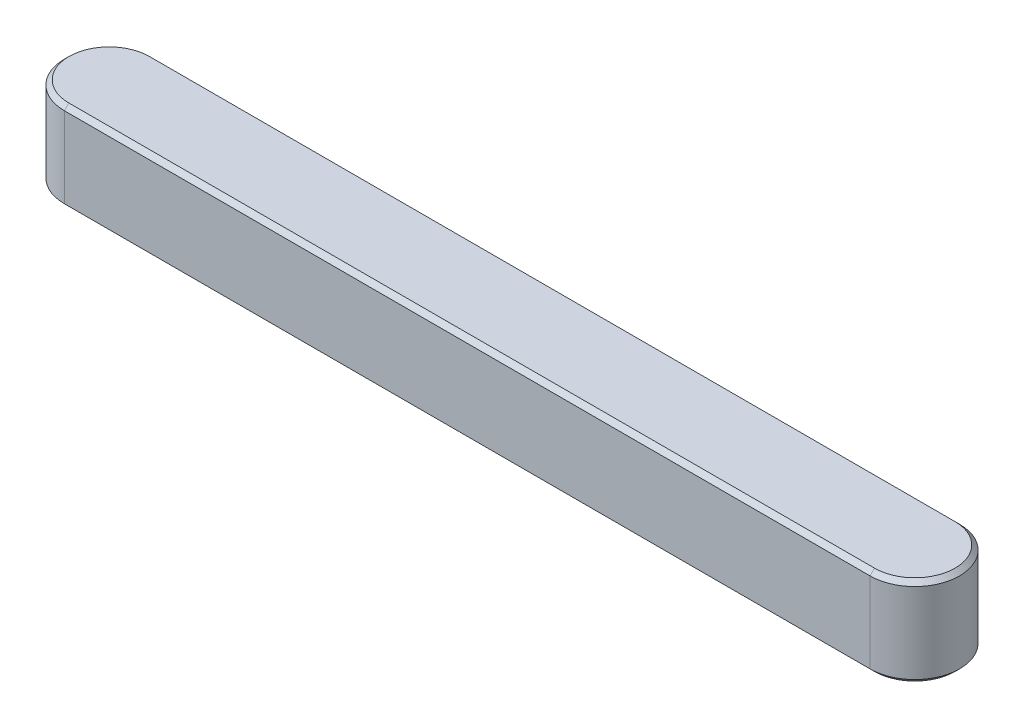
ISO-10303-21;
HEADER;
FILE_DESCRIPTION(('STEP AP214'),'2;1');
FILE_NAME('part.step','',(''),(''),'','','');
FILE_SCHEMA(('AUTOMOTIVE_DESIGN { 1 0 10303 214 1 1 1 1 }'));
ENDSEC;
DATA;
#1=APPLICATION_CONTEXT('core data for automotive mechanical design processes');
#2=APPLICATION_PROTOCOL_DEFINITION('international standard','automotive_design',2000,#1);
#3=PRODUCT_CONTEXT('',#1,'mechanical');
#4=PRODUCT('Part','Part','',(#3));
#5=PRODUCT_RELATED_PRODUCT_CATEGORY('part','',(#4));
#6=PRODUCT_DEFINITION_FORMATION('','',#4);
#7=PRODUCT_DEFINITION_CONTEXT('part definition',#1,'design');
#8=PRODUCT_DEFINITION('design','',#6,#7);
#9=PRODUCT_DEFINITION_SHAPE('','',#8);
#10=(LENGTH_UNIT() NAMED_UNIT(*) SI_UNIT(.MILLI.,.METRE.));
#11=(NAMED_UNIT(*) PLANE_ANGLE_UNIT() SI_UNIT($,.RADIAN.));
#12=(NAMED_UNIT(*) SI_UNIT($,.STERADIAN.) SOLID_ANGLE_UNIT());
#13=UNCERTAINTY_MEASURE_WITH_UNIT(LENGTH_MEASURE(1.E-05),#10,'distance_accuracy_value','');
#14=(GEOMETRIC_REPRESENTATION_CONTEXT(3) GLOBAL_UNCERTAINTY_ASSIGNED_CONTEXT((#13)) GLOBAL_UNIT_ASSIGNED_CONTEXT((#10,
#11,#12)) REPRESENTATION_CONTEXT('',''));
#15=CARTESIAN_POINT('',(0.,0.,0.));
#16=DIRECTION('',(0.,0.,1.));
#17=DIRECTION('',(1.,0.,0.));
#18=AXIS2_PLACEMENT_3D('',#15,#16,#17);
#19=CARTESIAN_POINT('',(27.,0.,0.));
#20=DIRECTION('',(0.,-1.,0.));
#21=DIRECTION('',(0.,0.,-1.));
#22=AXIS2_PLACEMENT_3D('',#19,#20,#21);
#23=CYLINDRICAL_SURFACE('',#22,3.);
#24=DIRECTION('',(0.,-1.,0.));
#25=VECTOR('',#24,1.);
#26=CARTESIAN_POINT('',(27.,6.,2.99999999999999));
#27=LINE('',#26,#25);
#28=CARTESIAN_POINT('',(27.,0.299999999999995,2.99999999999999));
#29=VERTEX_POINT('',#28);
#30=CARTESIAN_POINT('',(27.,5.7,2.99999999999999));
#31=VERTEX_POINT('',#30);
#32=EDGE_CURVE('E132',#29,#31,#27,.F.);
#33=ORIENTED_EDGE('',*,*,#32,.F.);
#34=CARTESIAN_POINT('',(27.,0.299999999999995,0.));
#35=DIRECTION('',(0.,1.,0.));
#36=DIRECTION('',(0.,0.,1.));
#37=AXIS2_PLACEMENT_3D('',#34,#35,#36);
#38=CIRCLE('',#37,3.);
#39=CARTESIAN_POINT('',(27.,0.299999999999995,-2.99999999999999));
#40=VERTEX_POINT('',#39);
#41=EDGE_CURVE('E117',#29,#40,#38,.T.);
#42=ORIENTED_EDGE('',*,*,#41,.T.);
#43=DIRECTION('',(0.,-1.,0.));
#44=VECTOR('',#43,1.);
#45=CARTESIAN_POINT('',(27.,6.,-2.99999999999999));
#46=LINE('',#45,#44);
#47=CARTESIAN_POINT('',(27.,5.7,-2.99999999999999));
#48=VERTEX_POINT('',#47);
#49=EDGE_CURVE('E125',#48,#40,#46,.T.);
#50=ORIENTED_EDGE('',*,*,#49,.F.);
#51=CARTESIAN_POINT('',(27.,5.7,0.));
#52=DIRECTION('',(0.,1.,0.));
#53=DIRECTION('',(0.,0.,1.));
#54=AXIS2_PLACEMENT_3D('',#51,#52,#53);
#55=CIRCLE('',#54,3.);
#56=EDGE_CURVE('E110',#48,#31,#55,.F.);
#57=ORIENTED_EDGE('',*,*,#56,.T.);
#58=EDGE_LOOP('',(#33,#42,#50,#57));
#59=FACE_BOUND('',#58,.T.);
#60=ADVANCED_FACE('F35',(#59),#23,.T.);
#61=CARTESIAN_POINT('',(-27.,6.,0.));
#62=DIRECTION('',(0.,-1.,0.));
#63=DIRECTION('',(0.,0.,-1.));
#64=AXIS2_PLACEMENT_3D('',#61,#62,#63);
#65=CYLINDRICAL_SURFACE('',#64,3.);
#66=DIRECTION('',(0.,-1.,0.));
#67=VECTOR('',#66,1.);
#68=CARTESIAN_POINT('',(-27.,6.,-3.));
#69=LINE('',#68,#67);
#70=CARTESIAN_POINT('',(-27.,0.299999999999995,-3.));
#71=VERTEX_POINT('',#70);
#72=CARTESIAN_POINT('',(-27.,5.7,-3.));
#73=VERTEX_POINT('',#72);
#74=EDGE_CURVE('E128',#71,#73,#69,.F.);
#75=ORIENTED_EDGE('',*,*,#74,.F.);
#76=CARTESIAN_POINT('',(-27.,0.299999999999995,0.));
#77=DIRECTION('',(0.,1.,0.));
#78=DIRECTION('',(0.,0.,1.));
#79=AXIS2_PLACEMENT_3D('',#76,#77,#78);
#80=CIRCLE('',#79,3.);
#81=CARTESIAN_POINT('',(-27.,0.299999999999995,3.));
#82=VERTEX_POINT('',#81);
#83=EDGE_CURVE('E118',#71,#82,#80,.T.);
#84=ORIENTED_EDGE('',*,*,#83,.T.);
#85=DIRECTION('',(0.,-1.,0.));
#86=VECTOR('',#85,1.);
#87=CARTESIAN_POINT('',(-27.,6.,3.));
#88=LINE('',#87,#86);
#89=CARTESIAN_POINT('',(-27.,5.7,3.));
#90=VERTEX_POINT('',#89);
#91=EDGE_CURVE('E169',#90,#82,#88,.T.);
#92=ORIENTED_EDGE('',*,*,#91,.F.);
#93=CARTESIAN_POINT('',(-27.,5.7,0.));
#94=DIRECTION('',(0.,1.,0.));
#95=DIRECTION('',(0.,0.,1.));
#96=AXIS2_PLACEMENT_3D('',#93,#94,#95);
#97=CIRCLE('',#96,3.);
#98=EDGE_CURVE('E147',#90,#73,#97,.F.);
#99=ORIENTED_EDGE('',*,*,#98,.T.);
#100=EDGE_LOOP('',(#75,#84,#92,#99));
#101=FACE_BOUND('',#100,.T.);
#102=ADVANCED_FACE('F192',(#101),#65,.T.);
#103=CARTESIAN_POINT('',(-30.,6.,3.));
#104=DIRECTION('',(0.,0.,-1.));
#105=DIRECTION('',(-1.,0.,0.));
#106=AXIS2_PLACEMENT_3D('',#103,#104,#105);
#107=PLANE('',#106);
#108=ORIENTED_EDGE('',*,*,#91,.T.);
#109=DIRECTION('',(1.,0.,0.));
#110=VECTOR('',#109,1.);
#111=CARTESIAN_POINT('',(-30.,0.299999999999995,3.));
#112=LINE('',#111,#110);
#113=EDGE_CURVE('E153',#82,#29,#112,.T.);
#114=ORIENTED_EDGE('',*,*,#113,.T.);
#115=ORIENTED_EDGE('',*,*,#32,.T.);
#116=DIRECTION('',(-1.,0.,0.));
#117=VECTOR('',#116,1.);
#118=CARTESIAN_POINT('',(-27.,5.7,3.));
#119=LINE('',#118,#117);
#120=EDGE_CURVE('E151',#31,#90,#119,.T.);
#121=ORIENTED_EDGE('',*,*,#120,.T.);
#122=EDGE_LOOP('',(#108,#114,#115,#121));
#123=FACE_BOUND('',#122,.T.);
#124=ADVANCED_FACE('F189',(#123),#107,.F.);
#125=CARTESIAN_POINT('',(-30.,6.,-3.));
#126=DIRECTION('',(0.,0.,1.));
#127=DIRECTION('',(1.,0.,0.));
#128=AXIS2_PLACEMENT_3D('',#125,#126,#127);
#129=PLANE('',#128);
#130=ORIENTED_EDGE('',*,*,#49,.T.);
#131=DIRECTION('',(-1.,0.,0.));
#132=VECTOR('',#131,1.);
#133=CARTESIAN_POINT('',(-30.,0.299999999999995,-3.));
#134=LINE('',#133,#132);
#135=EDGE_CURVE('E129',#40,#71,#134,.T.);
#136=ORIENTED_EDGE('',*,*,#135,.T.);
#137=ORIENTED_EDGE('',*,*,#74,.T.);
#138=DIRECTION('',(1.,0.,0.));
#139=VECTOR('',#138,1.);
#140=CARTESIAN_POINT('',(27.,5.7,-2.99999999999999));
#141=LINE('',#140,#139);
#142=EDGE_CURVE('E105',#73,#48,#141,.T.);
#143=ORIENTED_EDGE('',*,*,#142,.T.);
#144=EDGE_LOOP('',(#130,#136,#137,#143));
#145=FACE_BOUND('',#144,.T.);
#146=ADVANCED_FACE('F123',(#145),#129,.F.);
#147=CARTESIAN_POINT('',(0.,6.,0.));
#148=DIRECTION('',(0.,1.,0.));
#149=DIRECTION('',(0.,0.,1.));
#150=AXIS2_PLACEMENT_3D('',#147,#148,#149);
#151=PLANE('',#150);
#152=CARTESIAN_POINT('',(27.,6.,0.));
#153=DIRECTION('',(0.,1.,0.));
#154=DIRECTION('',(0.,0.,1.));
#155=AXIS2_PLACEMENT_3D('',#152,#153,#154);
#156=CIRCLE('',#155,2.7);
#157=CARTESIAN_POINT('',(27.,6.,2.7));
#158=VERTEX_POINT('',#157);
#159=CARTESIAN_POINT('',(27.,6.,-2.7));
#160=VERTEX_POINT('',#159);
#161=EDGE_CURVE('E59',#158,#160,#156,.T.);
#162=ORIENTED_EDGE('',*,*,#161,.T.);
#163=DIRECTION('',(-1.,0.,0.));
#164=VECTOR('',#163,1.);
#165=CARTESIAN_POINT('',(-27.,6.,-2.70000000000001));
#166=LINE('',#165,#164);
#167=CARTESIAN_POINT('',(-27.,6.,-2.7));
#168=VERTEX_POINT('',#167);
#169=EDGE_CURVE('E11',#160,#168,#166,.T.);
#170=ORIENTED_EDGE('',*,*,#169,.T.);
#171=CARTESIAN_POINT('',(-27.,6.,0.));
#172=DIRECTION('',(0.,1.,0.));
#173=DIRECTION('',(0.,0.,1.));
#174=AXIS2_PLACEMENT_3D('',#171,#172,#173);
#175=CIRCLE('',#174,2.7);
#176=CARTESIAN_POINT('',(-27.,6.,2.70000000000001));
#177=VERTEX_POINT('',#176);
#178=EDGE_CURVE('E44',#168,#177,#175,.T.);
#179=ORIENTED_EDGE('',*,*,#178,.T.);
#180=DIRECTION('',(1.,0.,0.));
#181=VECTOR('',#180,1.);
#182=CARTESIAN_POINT('',(27.,6.,2.7));
#183=LINE('',#182,#181);
#184=EDGE_CURVE('E155',#177,#158,#183,.T.);
#185=ORIENTED_EDGE('',*,*,#184,.T.);
#186=EDGE_LOOP('',(#162,#170,#179,#185));
#187=FACE_BOUND('',#186,.T.);
#188=ADVANCED_FACE('F178',(#187),#151,.T.);
#189=CARTESIAN_POINT('',(0.,0.,0.));
#190=DIRECTION('',(0.,1.,0.));
#191=DIRECTION('',(0.,0.,1.));
#192=AXIS2_PLACEMENT_3D('',#189,#190,#191);
#193=PLANE('',#192);
#194=CARTESIAN_POINT('',(-27.,0.,0.));
#195=DIRECTION('',(0.,1.,0.));
#196=DIRECTION('',(0.,0.,1.));
#197=AXIS2_PLACEMENT_3D('',#194,#195,#196);
#198=CIRCLE('',#197,2.7);
#199=CARTESIAN_POINT('',(-27.,0.,2.7));
#200=VERTEX_POINT('',#199);
#201=CARTESIAN_POINT('',(-27.,0.,-2.7));
#202=VERTEX_POINT('',#201);
#203=EDGE_CURVE('E142',#200,#202,#198,.F.);
#204=ORIENTED_EDGE('',*,*,#203,.T.);
#205=DIRECTION('',(1.,0.,0.));
#206=VECTOR('',#205,1.);
#207=CARTESIAN_POINT('',(0.,0.,-2.69999999999999));
#208=LINE('',#207,#206);
#209=CARTESIAN_POINT('',(27.,0.,-2.69999999999999));
#210=VERTEX_POINT('',#209);
#211=EDGE_CURVE('E144',#202,#210,#208,.T.);
#212=ORIENTED_EDGE('',*,*,#211,.T.);
#213=CARTESIAN_POINT('',(27.,0.,0.));
#214=DIRECTION('',(0.,1.,0.));
#215=DIRECTION('',(0.,0.,1.));
#216=AXIS2_PLACEMENT_3D('',#213,#214,#215);
#217=CIRCLE('',#216,2.69999999999999);
#218=CARTESIAN_POINT('',(27.,0.,2.69999999999999));
#219=VERTEX_POINT('',#218);
#220=EDGE_CURVE('E140',#210,#219,#217,.F.);
#221=ORIENTED_EDGE('',*,*,#220,.T.);
#222=DIRECTION('',(-1.,0.,0.));
#223=VECTOR('',#222,1.);
#224=CARTESIAN_POINT('',(0.,0.,2.69999999999999));
#225=LINE('',#224,#223);
#226=EDGE_CURVE('E138',#219,#200,#225,.T.);
#227=ORIENTED_EDGE('',*,*,#226,.T.);
#228=EDGE_LOOP('',(#204,#212,#221,#227));
#229=FACE_BOUND('',#228,.T.);
#230=ADVANCED_FACE('F180',(#229),#193,.F.);
#231=CARTESIAN_POINT('',(-30.,0.299999999999995,3.));
#232=DIRECTION('',(0.,0.707106781186555,-0.70710678118654));
#233=DIRECTION('',(1.,0.,0.));
#234=AXIS2_PLACEMENT_3D('',#231,#232,#233);
#235=PLANE('',#234);
#236=DIRECTION('',(0.,0.70710678118654,0.707106781186555));
#237=VECTOR('',#236,1.);
#238=CARTESIAN_POINT('',(-27.,0.,2.7));
#239=LINE('',#238,#237);
#240=EDGE_CURVE('E163',#200,#82,#239,.T.);
#241=ORIENTED_EDGE('',*,*,#240,.F.);
#242=ORIENTED_EDGE('',*,*,#226,.F.);
#243=DIRECTION('',(0.,-0.70710678118654,-0.707106781186555));
#244=VECTOR('',#243,1.);
#245=CARTESIAN_POINT('',(27.,0.299999999999995,2.99999999999999));
#246=LINE('',#245,#244);
#247=EDGE_CURVE('E166',#29,#219,#246,.T.);
#248=ORIENTED_EDGE('',*,*,#247,.F.);
#249=ORIENTED_EDGE('',*,*,#113,.F.);
#250=EDGE_LOOP('',(#241,#242,#248,#249));
#251=FACE_BOUND('',#250,.T.);
#252=ADVANCED_FACE('F186',(#251),#235,.F.);
#253=CARTESIAN_POINT('',(27.,0.,0.));
#254=DIRECTION('',(0.,1.,0.));
#255=DIRECTION('',(0.,0.,1.));
#256=AXIS2_PLACEMENT_3D('',#253,#254,#255);
#257=CONICAL_SURFACE('',#256,2.69999999999999,0.78539816339746);
#258=ORIENTED_EDGE('',*,*,#247,.T.);
#259=ORIENTED_EDGE('',*,*,#220,.F.);
#260=DIRECTION('',(0.,-0.707106781186539,0.707106781186556));
#261=VECTOR('',#260,1.);
#262=CARTESIAN_POINT('',(27.,0.299999999999995,-3.));
#263=LINE('',#262,#261);
#264=EDGE_CURVE('E161',#40,#210,#263,.T.);
#265=ORIENTED_EDGE('',*,*,#264,.F.);
#266=ORIENTED_EDGE('',*,*,#41,.F.);
#267=EDGE_LOOP('',(#258,#259,#265,#266));
#268=FACE_BOUND('',#267,.T.);
#269=ADVANCED_FACE('F208',(#268),#257,.T.);
#270=CARTESIAN_POINT('',(-27.,0.,0.));
#271=DIRECTION('',(0.,1.,0.));
#272=DIRECTION('',(0.,0.,1.));
#273=AXIS2_PLACEMENT_3D('',#270,#271,#272);
#274=CONICAL_SURFACE('',#273,2.7,0.78539816339746);
#275=ORIENTED_EDGE('',*,*,#240,.T.);
#276=ORIENTED_EDGE('',*,*,#83,.F.);
#277=DIRECTION('',(0.,0.707106781186539,-0.707106781186556));
#278=VECTOR('',#277,1.);
#279=CARTESIAN_POINT('',(-27.,0.,-2.7));
#280=LINE('',#279,#278);
#281=EDGE_CURVE('E159',#202,#71,#280,.T.);
#282=ORIENTED_EDGE('',*,*,#281,.F.);
#283=ORIENTED_EDGE('',*,*,#203,.F.);
#284=EDGE_LOOP('',(#275,#276,#282,#283));
#285=FACE_BOUND('',#284,.T.);
#286=ADVANCED_FACE('F204',(#285),#274,.T.);
#287=CARTESIAN_POINT('',(-30.,0.299999999999995,-3.));
#288=DIRECTION('',(0.,0.707106781186555,0.70710678118654));
#289=DIRECTION('',(-1.,0.,0.));
#290=AXIS2_PLACEMENT_3D('',#287,#288,#289);
#291=PLANE('',#290);
#292=ORIENTED_EDGE('',*,*,#264,.T.);
#293=ORIENTED_EDGE('',*,*,#211,.F.);
#294=ORIENTED_EDGE('',*,*,#281,.T.);
#295=ORIENTED_EDGE('',*,*,#135,.F.);
#296=EDGE_LOOP('',(#292,#293,#294,#295));
#297=FACE_BOUND('',#296,.T.);
#298=ADVANCED_FACE('F201',(#297),#291,.F.);
#299=CARTESIAN_POINT('',(0.,6.,2.7));
#300=DIRECTION('',(0.,0.707106781186539,0.707106781186556));
#301=DIRECTION('',(-1.,0.,0.));
#302=AXIS2_PLACEMENT_3D('',#299,#300,#301);
#303=PLANE('',#302);
#304=DIRECTION('',(0.,0.707106781186556,-0.707106781186539));
#305=VECTOR('',#304,1.);
#306=CARTESIAN_POINT('',(-27.,5.7,3.));
#307=LINE('',#306,#305);
#308=EDGE_CURVE('E107',#90,#177,#307,.T.);
#309=ORIENTED_EDGE('',*,*,#308,.F.);
#310=ORIENTED_EDGE('',*,*,#120,.F.);
#311=DIRECTION('',(0.,-0.707106781186556,0.707106781186539));
#312=VECTOR('',#311,1.);
#313=CARTESIAN_POINT('',(27.,6.,2.7));
#314=LINE('',#313,#312);
#315=EDGE_CURVE('E39',#158,#31,#314,.T.);
#316=ORIENTED_EDGE('',*,*,#315,.F.);
#317=ORIENTED_EDGE('',*,*,#184,.F.);
#318=EDGE_LOOP('',(#309,#310,#316,#317));
#319=FACE_BOUND('',#318,.T.);
#320=ADVANCED_FACE('F37',(#319),#303,.T.);
#321=CARTESIAN_POINT('',(27.,6.,0.));
#322=DIRECTION('',(0.,-1.,0.));
#323=DIRECTION('',(0.,0.,-1.));
#324=AXIS2_PLACEMENT_3D('',#321,#322,#323);
#325=CONICAL_SURFACE('',#324,2.7,0.785398163397437);
#326=ORIENTED_EDGE('',*,*,#315,.T.);
#327=ORIENTED_EDGE('',*,*,#56,.F.);
#328=DIRECTION('',(0.,-0.707106781186556,-0.707106781186539));
#329=VECTOR('',#328,1.);
#330=CARTESIAN_POINT('',(27.,6.,-2.7));
#331=LINE('',#330,#329);
#332=EDGE_CURVE('E101',#160,#48,#331,.T.);
#333=ORIENTED_EDGE('',*,*,#332,.F.);
#334=ORIENTED_EDGE('',*,*,#161,.F.);
#335=EDGE_LOOP('',(#326,#327,#333,#334));
#336=FACE_BOUND('',#335,.T.);
#337=ADVANCED_FACE('F111',(#336),#325,.T.);
#338=CARTESIAN_POINT('',(-27.,6.,0.));
#339=DIRECTION('',(0.,-1.,0.));
#340=DIRECTION('',(0.,0.,-1.));
#341=AXIS2_PLACEMENT_3D('',#338,#339,#340);
#342=CONICAL_SURFACE('',#341,2.7,0.785398163397437);
#343=ORIENTED_EDGE('',*,*,#308,.T.);
#344=ORIENTED_EDGE('',*,*,#178,.F.);
#345=DIRECTION('',(0.,0.707106781186556,0.707106781186539));
#346=VECTOR('',#345,1.);
#347=CARTESIAN_POINT('',(-27.,5.7,-3.));
#348=LINE('',#347,#346);
#349=EDGE_CURVE('E52',#73,#168,#348,.T.);
#350=ORIENTED_EDGE('',*,*,#349,.F.);
#351=ORIENTED_EDGE('',*,*,#98,.F.);
#352=EDGE_LOOP('',(#343,#344,#350,#351));
#353=FACE_BOUND('',#352,.T.);
#354=ADVANCED_FACE('F174',(#353),#342,.T.);
#355=CARTESIAN_POINT('',(0.,6.,-2.7));
#356=DIRECTION('',(0.,0.707106781186539,-0.707106781186556));
#357=DIRECTION('',(1.,0.,0.));
#358=AXIS2_PLACEMENT_3D('',#355,#356,#357);
#359=PLANE('',#358);
#360=ORIENTED_EDGE('',*,*,#332,.T.);
#361=ORIENTED_EDGE('',*,*,#142,.F.);
#362=ORIENTED_EDGE('',*,*,#349,.T.);
#363=ORIENTED_EDGE('',*,*,#169,.F.);
#364=EDGE_LOOP('',(#360,#361,#362,#363));
#365=FACE_BOUND('',#364,.T.);
#366=ADVANCED_FACE('F103',(#365),#359,.T.);
#367=CLOSED_SHELL('',(#60,#102,#124,#146,#188,#230,#252,#269,#286,#298,#320,#337,#354,#366));
#368=MANIFOLD_SOLID_BREP('B2',#367);
#369=ADVANCED_BREP_SHAPE_REPRESENTATION('',(#18,#368),#14);
#370=SHAPE_DEFINITION_REPRESENTATION(#9,#369);
ENDSEC;
END-ISO-10303-21;
